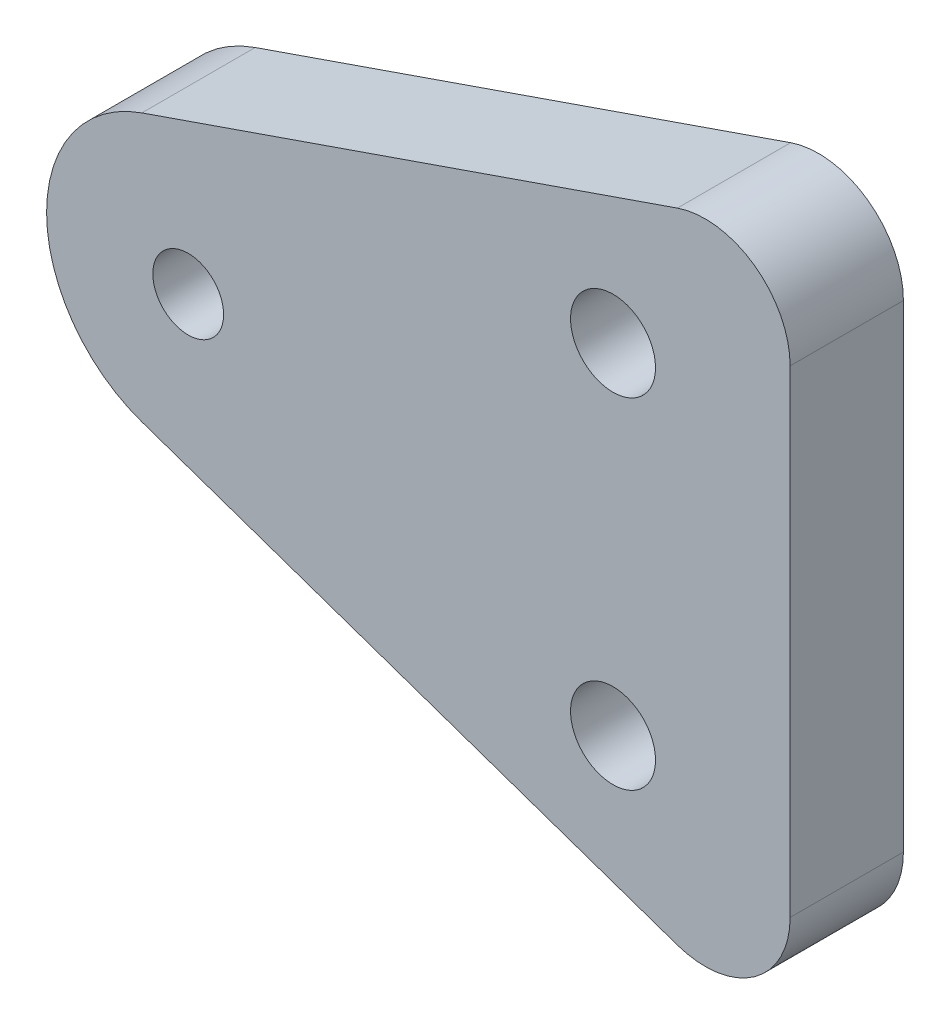
ISO-10303-21;
HEADER;
FILE_DESCRIPTION(('STEP AP214'),'2;1');
FILE_NAME('part.step','',(''),(''),'','','');
FILE_SCHEMA(('AUTOMOTIVE_DESIGN { 1 0 10303 214 1 1 1 1 }'));
ENDSEC;
DATA;
#1=APPLICATION_CONTEXT('core data for automotive mechanical design processes');
#2=APPLICATION_PROTOCOL_DEFINITION('international standard','automotive_design',2000,#1);
#3=PRODUCT_CONTEXT('',#1,'mechanical');
#4=PRODUCT('Part','Part','',(#3));
#5=PRODUCT_RELATED_PRODUCT_CATEGORY('part','',(#4));
#6=PRODUCT_DEFINITION_FORMATION('','',#4);
#7=PRODUCT_DEFINITION_CONTEXT('part definition',#1,'design');
#8=PRODUCT_DEFINITION('design','',#6,#7);
#9=PRODUCT_DEFINITION_SHAPE('','',#8);
#10=(LENGTH_UNIT() NAMED_UNIT(*) SI_UNIT(.MILLI.,.METRE.));
#11=(NAMED_UNIT(*) PLANE_ANGLE_UNIT() SI_UNIT($,.RADIAN.));
#12=(NAMED_UNIT(*) SI_UNIT($,.STERADIAN.) SOLID_ANGLE_UNIT());
#13=UNCERTAINTY_MEASURE_WITH_UNIT(LENGTH_MEASURE(1.E-05),#10,'distance_accuracy_value','');
#14=(GEOMETRIC_REPRESENTATION_CONTEXT(3) GLOBAL_UNCERTAINTY_ASSIGNED_CONTEXT((#13)) GLOBAL_UNIT_ASSIGNED_CONTEXT((#10,
#11,#12)) REPRESENTATION_CONTEXT('',''));
#15=CARTESIAN_POINT('',(0.,0.,0.));
#16=DIRECTION('',(0.,0.,1.));
#17=DIRECTION('',(1.,0.,0.));
#18=AXIS2_PLACEMENT_3D('',#15,#16,#17);
#19=CARTESIAN_POINT('',(-5.00000000000432,19.9999999999964,4.));
#20=DIRECTION('',(0.,0.,1.));
#21=DIRECTION('',(1.,0.,0.));
#22=AXIS2_PLACEMENT_3D('',#19,#20,#21);
#23=PLANE('',#22);
#24=CARTESIAN_POINT('',(9.99999999999568,25.9999999999964,4.));
#25=DIRECTION('',(0.,0.,1.));
#26=DIRECTION('',(1.,0.,0.));
#27=AXIS2_PLACEMENT_3D('',#24,#25,#26);
#28=CIRCLE('',#27,1.50000000000597);
#29=CARTESIAN_POINT('',(11.5000000000017,25.9999999999964,4.));
#30=VERTEX_POINT('',#29);
#31=EDGE_CURVE('E254',#30,#30,#28,.T.);
#32=ORIENTED_EDGE('',*,*,#31,.F.);
#33=EDGE_LOOP('',(#32));
#34=FACE_BOUND('',#33,.T.);
#35=DIRECTION('',(0.945018152108045,-0.327017877472006,0.));
#36=VECTOR('',#35,1.);
#37=CARTESIAN_POINT('',(-6.63508938736436,15.2749092394562,4.));
#38=LINE('',#37,#36);
#39=CARTESIAN_POINT('',(-6.63508938736436,15.2749092394562,4.));
#40=VERTEX_POINT('',#39);
#41=CARTESIAN_POINT('',(12.2718840461784,8.73226420362852,4.));
#42=VERTEX_POINT('',#41);
#43=EDGE_CURVE('E87',#40,#42,#38,.T.);
#44=ORIENTED_EDGE('',*,*,#43,.T.);
#45=CARTESIAN_POINT('',(13.2529376785944,11.5673186599527,4.));
#46=DIRECTION('',(0.,0.,1.));
#47=DIRECTION('',(1.,0.,0.));
#48=AXIS2_PLACEMENT_3D('',#45,#46,#47);
#49=CIRCLE('',#48,3.);
#50=CARTESIAN_POINT('',(16.2529376785944,11.5673186599527,4.));
#51=VERTEX_POINT('',#50);
#52=EDGE_CURVE('E42',#42,#51,#49,.T.);
#53=ORIENTED_EDGE('',*,*,#52,.T.);
#54=DIRECTION('',(0.,1.,0.));
#55=VECTOR('',#54,1.);
#56=CARTESIAN_POINT('',(16.2529376785944,7.35464441286491,4.));
#57=LINE('',#56,#55);
#58=CARTESIAN_POINT('',(16.2529376785944,28.4326813400402,4.));
#59=VERTEX_POINT('',#58);
#60=EDGE_CURVE('E94',#51,#59,#57,.T.);
#61=ORIENTED_EDGE('',*,*,#60,.T.);
#62=CARTESIAN_POINT('',(13.2529376785944,28.4326813400402,4.));
#63=DIRECTION('',(0.,0.,1.));
#64=DIRECTION('',(1.,0.,0.));
#65=AXIS2_PLACEMENT_3D('',#62,#63,#64);
#66=CIRCLE('',#65,3.);
#67=CARTESIAN_POINT('',(12.2718840461784,31.2677357963644,4.));
#68=VERTEX_POINT('',#67);
#69=EDGE_CURVE('E49',#59,#68,#66,.T.);
#70=ORIENTED_EDGE('',*,*,#69,.T.);
#71=DIRECTION('',(-0.945018152108045,-0.327017877472006,0.));
#72=VECTOR('',#71,1.);
#73=CARTESIAN_POINT('',(16.2529376785944,32.645355587128,4.));
#74=LINE('',#73,#72);
#75=CARTESIAN_POINT('',(-6.63508938736437,24.7250907605367,4.));
#76=VERTEX_POINT('',#75);
#77=EDGE_CURVE('E99',#68,#76,#74,.T.);
#78=ORIENTED_EDGE('',*,*,#77,.T.);
#79=CARTESIAN_POINT('',(-5.00000000000432,19.9999999999964,4.));
#80=DIRECTION('',(0.,0.,1.));
#81=DIRECTION('',(1.,0.,0.));
#82=AXIS2_PLACEMENT_3D('',#79,#80,#81);
#83=CIRCLE('',#82,5.00000000000001);
#84=EDGE_CURVE('E95',#76,#40,#83,.T.);
#85=ORIENTED_EDGE('',*,*,#84,.T.);
#86=EDGE_LOOP('',(#44,#53,#61,#70,#78,#85));
#87=FACE_BOUND('',#86,.T.);
#88=CARTESIAN_POINT('',(-5.00000000000432,19.9999999999964,4.));
#89=DIRECTION('',(0.,0.,1.));
#90=DIRECTION('',(1.,0.,0.));
#91=AXIS2_PLACEMENT_3D('',#88,#89,#90);
#92=CIRCLE('',#91,1.25);
#93=CARTESIAN_POINT('',(-3.75000000000432,19.9999999999964,4.));
#94=VERTEX_POINT('',#93);
#95=EDGE_CURVE('E140',#94,#94,#92,.T.);
#96=ORIENTED_EDGE('',*,*,#95,.F.);
#97=EDGE_LOOP('',(#96));
#98=FACE_BOUND('',#97,.T.);
#99=CARTESIAN_POINT('',(9.99999999999568,13.9999999999964,4.));
#100=DIRECTION('',(0.,0.,1.));
#101=DIRECTION('',(1.,0.,0.));
#102=AXIS2_PLACEMENT_3D('',#99,#100,#101);
#103=CIRCLE('',#102,1.50000000000597);
#104=CARTESIAN_POINT('',(11.5000000000017,13.9999999999964,4.));
#105=VERTEX_POINT('',#104);
#106=EDGE_CURVE('E245',#105,#105,#103,.T.);
#107=ORIENTED_EDGE('',*,*,#106,.F.);
#108=EDGE_LOOP('',(#107));
#109=FACE_BOUND('',#108,.T.);
#110=ADVANCED_FACE('F34',(#34,#87,#98,#109),#23,.T.);
#111=CARTESIAN_POINT('',(-5.00000000000432,19.9999999999964,0.));
#112=DIRECTION('',(0.,0.,1.));
#113=DIRECTION('',(1.,0.,0.));
#114=AXIS2_PLACEMENT_3D('',#111,#112,#113);
#115=PLANE('',#114);
#116=DIRECTION('',(0.,1.,0.));
#117=VECTOR('',#116,1.);
#118=CARTESIAN_POINT('',(16.2529376785944,7.35464441286491,0.));
#119=LINE('',#118,#117);
#120=CARTESIAN_POINT('',(16.2529376785944,11.5673186599527,0.));
#121=VERTEX_POINT('',#120);
#122=CARTESIAN_POINT('',(16.2529376785944,28.4326813400402,0.));
#123=VERTEX_POINT('',#122);
#124=EDGE_CURVE('E137',#121,#123,#119,.T.);
#125=ORIENTED_EDGE('',*,*,#124,.F.);
#126=CARTESIAN_POINT('',(13.2529376785944,11.5673186599527,0.));
#127=DIRECTION('',(0.,0.,1.));
#128=DIRECTION('',(1.,0.,0.));
#129=AXIS2_PLACEMENT_3D('',#126,#127,#128);
#130=CIRCLE('',#129,3.);
#131=CARTESIAN_POINT('',(12.2718840461784,8.73226420362852,0.));
#132=VERTEX_POINT('',#131);
#133=EDGE_CURVE('E120',#121,#132,#130,.F.);
#134=ORIENTED_EDGE('',*,*,#133,.T.);
#135=DIRECTION('',(0.945018152108045,-0.327017877472006,0.));
#136=VECTOR('',#135,1.);
#137=CARTESIAN_POINT('',(-6.63508938736436,15.2749092394562,0.));
#138=LINE('',#137,#136);
#139=CARTESIAN_POINT('',(-6.63508938736436,15.2749092394562,0.));
#140=VERTEX_POINT('',#139);
#141=EDGE_CURVE('E136',#140,#132,#138,.T.);
#142=ORIENTED_EDGE('',*,*,#141,.F.);
#143=CARTESIAN_POINT('',(-5.00000000000432,19.9999999999964,0.));
#144=DIRECTION('',(0.,0.,1.));
#145=DIRECTION('',(1.,0.,0.));
#146=AXIS2_PLACEMENT_3D('',#143,#144,#145);
#147=CIRCLE('',#146,5.00000000000001);
#148=CARTESIAN_POINT('',(-6.63508938736437,24.7250907605367,0.));
#149=VERTEX_POINT('',#148);
#150=EDGE_CURVE('E107',#149,#140,#147,.T.);
#151=ORIENTED_EDGE('',*,*,#150,.F.);
#152=DIRECTION('',(-0.945018152108045,-0.327017877472006,0.));
#153=VECTOR('',#152,1.);
#154=CARTESIAN_POINT('',(16.2529376785944,32.645355587128,0.));
#155=LINE('',#154,#153);
#156=CARTESIAN_POINT('',(12.2718840461784,31.2677357963644,0.));
#157=VERTEX_POINT('',#156);
#158=EDGE_CURVE('E103',#157,#149,#155,.T.);
#159=ORIENTED_EDGE('',*,*,#158,.F.);
#160=CARTESIAN_POINT('',(13.2529376785944,28.4326813400402,0.));
#161=DIRECTION('',(0.,0.,1.));
#162=DIRECTION('',(1.,0.,0.));
#163=AXIS2_PLACEMENT_3D('',#160,#161,#162);
#164=CIRCLE('',#163,3.);
#165=EDGE_CURVE('E118',#157,#123,#164,.F.);
#166=ORIENTED_EDGE('',*,*,#165,.T.);
#167=EDGE_LOOP('',(#125,#134,#142,#151,#159,#166));
#168=FACE_BOUND('',#167,.T.);
#169=CARTESIAN_POINT('',(-5.00000000000432,19.9999999999964,0.));
#170=DIRECTION('',(0.,0.,1.));
#171=DIRECTION('',(1.,0.,0.));
#172=AXIS2_PLACEMENT_3D('',#169,#170,#171);
#173=CIRCLE('',#172,1.25);
#174=CARTESIAN_POINT('',(-3.75000000000432,19.9999999999964,0.));
#175=VERTEX_POINT('',#174);
#176=EDGE_CURVE('E257',#175,#175,#173,.T.);
#177=ORIENTED_EDGE('',*,*,#176,.T.);
#178=EDGE_LOOP('',(#177));
#179=FACE_BOUND('',#178,.T.);
#180=CARTESIAN_POINT('',(9.99999999999568,25.9999999999964,0.));
#181=DIRECTION('',(0.,0.,1.));
#182=DIRECTION('',(1.,0.,0.));
#183=AXIS2_PLACEMENT_3D('',#180,#181,#182);
#184=CIRCLE('',#183,1.50000000000597);
#185=CARTESIAN_POINT('',(11.5000000000017,25.9999999999964,0.));
#186=VERTEX_POINT('',#185);
#187=EDGE_CURVE('E251',#186,#186,#184,.T.);
#188=ORIENTED_EDGE('',*,*,#187,.T.);
#189=EDGE_LOOP('',(#188));
#190=FACE_BOUND('',#189,.T.);
#191=CARTESIAN_POINT('',(9.99999999999568,13.9999999999964,0.));
#192=DIRECTION('',(0.,0.,1.));
#193=DIRECTION('',(1.,0.,0.));
#194=AXIS2_PLACEMENT_3D('',#191,#192,#193);
#195=CIRCLE('',#194,1.50000000000597);
#196=CARTESIAN_POINT('',(11.5000000000017,13.9999999999964,0.));
#197=VERTEX_POINT('',#196);
#198=EDGE_CURVE('E248',#197,#197,#195,.T.);
#199=ORIENTED_EDGE('',*,*,#198,.T.);
#200=EDGE_LOOP('',(#199));
#201=FACE_BOUND('',#200,.T.);
#202=ADVANCED_FACE('F134',(#168,#179,#190,#201),#115,.F.);
#203=CARTESIAN_POINT('',(-5.00000000000432,19.9999999999964,4.));
#204=DIRECTION('',(0.,0.,-1.));
#205=DIRECTION('',(-1.,0.,0.));
#206=AXIS2_PLACEMENT_3D('',#203,#204,#205);
#207=CYLINDRICAL_SURFACE('',#206,5.00000000000001);
#208=ORIENTED_EDGE('',*,*,#150,.T.);
#209=DIRECTION('',(0.,0.,-1.));
#210=VECTOR('',#209,1.);
#211=CARTESIAN_POINT('',(-6.63508938736436,15.2749092394562,4.));
#212=LINE('',#211,#210);
#213=EDGE_CURVE('E91',#40,#140,#212,.T.);
#214=ORIENTED_EDGE('',*,*,#213,.F.);
#215=ORIENTED_EDGE('',*,*,#84,.F.);
#216=DIRECTION('',(0.,0.,-1.));
#217=VECTOR('',#216,1.);
#218=CARTESIAN_POINT('',(-6.63508938736437,24.7250907605367,4.));
#219=LINE('',#218,#217);
#220=EDGE_CURVE('E109',#76,#149,#219,.T.);
#221=ORIENTED_EDGE('',*,*,#220,.T.);
#222=EDGE_LOOP('',(#208,#214,#215,#221));
#223=FACE_BOUND('',#222,.T.);
#224=ADVANCED_FACE('F105',(#223),#207,.T.);
#225=CARTESIAN_POINT('',(-6.63508938736436,15.2749092394562,4.));
#226=DIRECTION('',(0.327017877472006,0.945018152108045,0.));
#227=DIRECTION('',(-0.945018152108045,0.327017877472006,0.));
#228=AXIS2_PLACEMENT_3D('',#225,#226,#227);
#229=PLANE('',#228);
#230=ORIENTED_EDGE('',*,*,#141,.T.);
#231=DIRECTION('',(0.,0.,-1.));
#232=VECTOR('',#231,1.);
#233=CARTESIAN_POINT('',(12.2718840461784,8.73226420362852,4.));
#234=LINE('',#233,#232);
#235=EDGE_CURVE('E57',#132,#42,#234,.F.);
#236=ORIENTED_EDGE('',*,*,#235,.T.);
#237=ORIENTED_EDGE('',*,*,#43,.F.);
#238=ORIENTED_EDGE('',*,*,#213,.T.);
#239=EDGE_LOOP('',(#230,#236,#237,#238));
#240=FACE_BOUND('',#239,.T.);
#241=ADVANCED_FACE('F89',(#240),#229,.F.);
#242=CARTESIAN_POINT('',(16.2529376785944,7.35464441286491,4.));
#243=DIRECTION('',(-1.,0.,0.));
#244=DIRECTION('',(0.,0.,1.));
#245=AXIS2_PLACEMENT_3D('',#242,#243,#244);
#246=PLANE('',#245);
#247=ORIENTED_EDGE('',*,*,#60,.F.);
#248=DIRECTION('',(0.,0.,-1.));
#249=VECTOR('',#248,1.);
#250=CARTESIAN_POINT('',(16.2529376785944,11.5673186599527,4.));
#251=LINE('',#250,#249);
#252=EDGE_CURVE('E111',#51,#121,#251,.T.);
#253=ORIENTED_EDGE('',*,*,#252,.T.);
#254=ORIENTED_EDGE('',*,*,#124,.T.);
#255=DIRECTION('',(0.,0.,-1.));
#256=VECTOR('',#255,1.);
#257=CARTESIAN_POINT('',(16.2529376785944,28.4326813400402,4.));
#258=LINE('',#257,#256);
#259=EDGE_CURVE('E108',#123,#59,#258,.F.);
#260=ORIENTED_EDGE('',*,*,#259,.T.);
#261=EDGE_LOOP('',(#247,#253,#254,#260));
#262=FACE_BOUND('',#261,.T.);
#263=ADVANCED_FACE('F127',(#262),#246,.F.);
#264=CARTESIAN_POINT('',(16.2529376785944,32.645355587128,4.));
#265=DIRECTION('',(0.327017877472006,-0.945018152108045,0.));
#266=DIRECTION('',(0.945018152108045,0.327017877472006,0.));
#267=AXIS2_PLACEMENT_3D('',#264,#265,#266);
#268=PLANE('',#267);
#269=ORIENTED_EDGE('',*,*,#77,.F.);
#270=DIRECTION('',(0.,0.,-1.));
#271=VECTOR('',#270,1.);
#272=CARTESIAN_POINT('',(12.2718840461784,31.2677357963644,4.));
#273=LINE('',#272,#271);
#274=EDGE_CURVE('E11',#68,#157,#273,.T.);
#275=ORIENTED_EDGE('',*,*,#274,.T.);
#276=ORIENTED_EDGE('',*,*,#158,.T.);
#277=ORIENTED_EDGE('',*,*,#220,.F.);
#278=EDGE_LOOP('',(#269,#275,#276,#277));
#279=FACE_BOUND('',#278,.T.);
#280=ADVANCED_FACE('F145',(#279),#268,.F.);
#281=CARTESIAN_POINT('',(-5.00000000000432,19.9999999999964,4.));
#282=DIRECTION('',(0.,0.,-1.));
#283=DIRECTION('',(-1.,0.,0.));
#284=AXIS2_PLACEMENT_3D('',#281,#282,#283);
#285=CYLINDRICAL_SURFACE('',#284,1.25);
#286=ORIENTED_EDGE('',*,*,#95,.T.);
#287=EDGE_LOOP('',(#286));
#288=FACE_BOUND('',#287,.T.);
#289=ORIENTED_EDGE('',*,*,#176,.F.);
#290=EDGE_LOOP('',(#289));
#291=FACE_BOUND('',#290,.T.);
#292=ADVANCED_FACE('F162',(#288,#291),#285,.F.);
#293=CARTESIAN_POINT('',(9.99999999999568,25.9999999999964,4.));
#294=DIRECTION('',(0.,0.,-1.));
#295=DIRECTION('',(-1.,0.,0.));
#296=AXIS2_PLACEMENT_3D('',#293,#294,#295);
#297=CYLINDRICAL_SURFACE('',#296,1.50000000000597);
#298=ORIENTED_EDGE('',*,*,#31,.T.);
#299=EDGE_LOOP('',(#298));
#300=FACE_BOUND('',#299,.T.);
#301=ORIENTED_EDGE('',*,*,#187,.F.);
#302=EDGE_LOOP('',(#301));
#303=FACE_BOUND('',#302,.T.);
#304=ADVANCED_FACE('F195',(#300,#303),#297,.F.);
#305=CARTESIAN_POINT('',(9.99999999999568,13.9999999999964,4.));
#306=DIRECTION('',(0.,0.,-1.));
#307=DIRECTION('',(-1.,0.,0.));
#308=AXIS2_PLACEMENT_3D('',#305,#306,#307);
#309=CYLINDRICAL_SURFACE('',#308,1.50000000000597);
#310=ORIENTED_EDGE('',*,*,#106,.T.);
#311=EDGE_LOOP('',(#310));
#312=FACE_BOUND('',#311,.T.);
#313=ORIENTED_EDGE('',*,*,#198,.F.);
#314=EDGE_LOOP('',(#313));
#315=FACE_BOUND('',#314,.T.);
#316=ADVANCED_FACE('F152',(#312,#315),#309,.F.);
#317=CARTESIAN_POINT('',(13.2529376785944,11.5673186599527,4.));
#318=DIRECTION('',(0.,0.,-1.));
#319=DIRECTION('',(-1.,0.,0.));
#320=AXIS2_PLACEMENT_3D('',#317,#318,#319);
#321=CYLINDRICAL_SURFACE('',#320,3.);
#322=ORIENTED_EDGE('',*,*,#52,.F.);
#323=ORIENTED_EDGE('',*,*,#235,.F.);
#324=ORIENTED_EDGE('',*,*,#133,.F.);
#325=ORIENTED_EDGE('',*,*,#252,.F.);
#326=EDGE_LOOP('',(#322,#323,#324,#325));
#327=FACE_BOUND('',#326,.T.);
#328=ADVANCED_FACE('F132',(#327),#321,.T.);
#329=CARTESIAN_POINT('',(13.2529376785944,28.4326813400402,4.));
#330=DIRECTION('',(0.,0.,-1.));
#331=DIRECTION('',(-1.,0.,0.));
#332=AXIS2_PLACEMENT_3D('',#329,#330,#331);
#333=CYLINDRICAL_SURFACE('',#332,3.);
#334=ORIENTED_EDGE('',*,*,#69,.F.);
#335=ORIENTED_EDGE('',*,*,#259,.F.);
#336=ORIENTED_EDGE('',*,*,#165,.F.);
#337=ORIENTED_EDGE('',*,*,#274,.F.);
#338=EDGE_LOOP('',(#334,#335,#336,#337));
#339=FACE_BOUND('',#338,.T.);
#340=ADVANCED_FACE('F36',(#339),#333,.T.);
#341=CLOSED_SHELL('',(#110,#202,#224,#241,#263,#280,#292,#304,#316,#328,#340));
#342=MANIFOLD_SOLID_BREP('B2',#341);
#343=ADVANCED_BREP_SHAPE_REPRESENTATION('',(#18,#342),#14);
#344=SHAPE_DEFINITION_REPRESENTATION(#9,#343);
ENDSEC;
END-ISO-10303-21;
